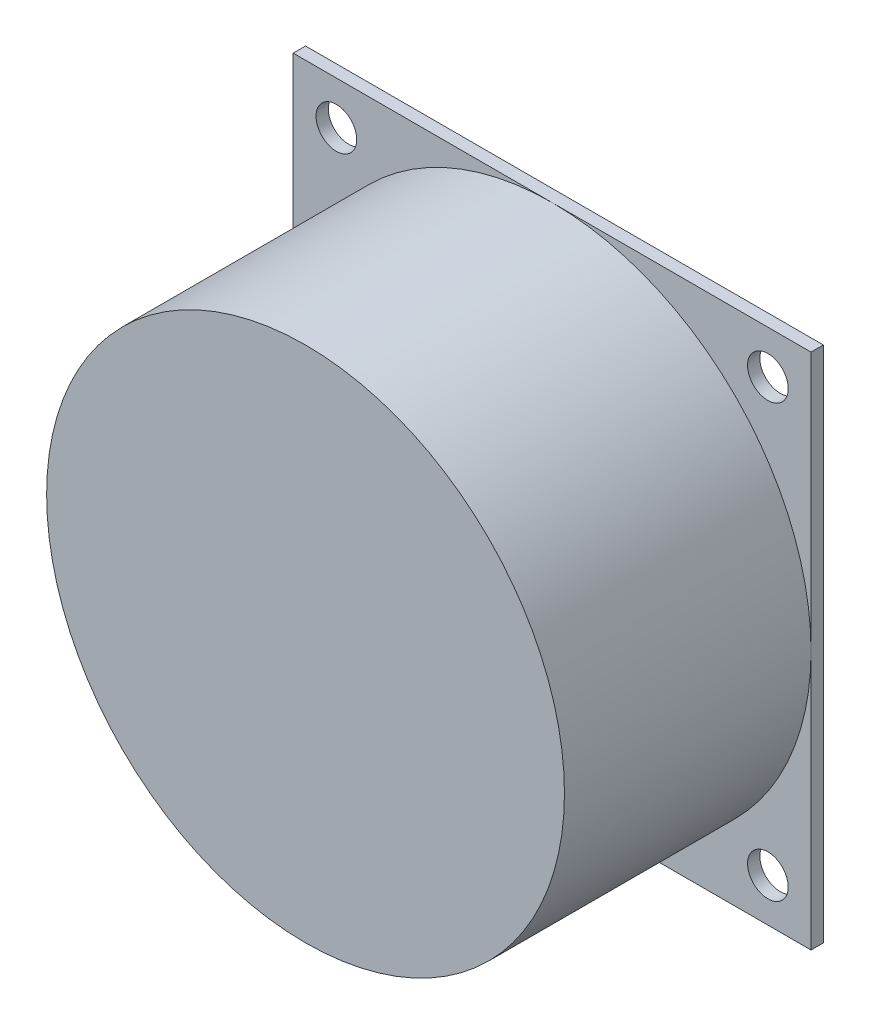
ISO-10303-21;
HEADER;
FILE_DESCRIPTION(('STEP AP214'),'2;1');
FILE_NAME('part.step','',(''),(''),'','','');
FILE_SCHEMA(('AUTOMOTIVE_DESIGN { 1 0 10303 214 1 1 1 1 }'));
ENDSEC;
DATA;
#1=APPLICATION_CONTEXT('core data for automotive mechanical design processes');
#2=APPLICATION_PROTOCOL_DEFINITION('international standard','automotive_design',2000,#1);
#3=PRODUCT_CONTEXT('',#1,'mechanical');
#4=PRODUCT('Part','Part','',(#3));
#5=PRODUCT_RELATED_PRODUCT_CATEGORY('part','',(#4));
#6=PRODUCT_DEFINITION_FORMATION('','',#4);
#7=PRODUCT_DEFINITION_CONTEXT('part definition',#1,'design');
#8=PRODUCT_DEFINITION('design','',#6,#7);
#9=PRODUCT_DEFINITION_SHAPE('','',#8);
#10=(LENGTH_UNIT() NAMED_UNIT(*) SI_UNIT(.MILLI.,.METRE.));
#11=(NAMED_UNIT(*) PLANE_ANGLE_UNIT() SI_UNIT($,.RADIAN.));
#12=(NAMED_UNIT(*) SI_UNIT($,.STERADIAN.) SOLID_ANGLE_UNIT());
#13=UNCERTAINTY_MEASURE_WITH_UNIT(LENGTH_MEASURE(1.E-05),#10,'distance_accuracy_value','');
#14=(GEOMETRIC_REPRESENTATION_CONTEXT(3) GLOBAL_UNCERTAINTY_ASSIGNED_CONTEXT((#13)) GLOBAL_UNIT_ASSIGNED_CONTEXT((#10,
#11,#12)) REPRESENTATION_CONTEXT('',''));
#15=CARTESIAN_POINT('',(0.,0.,0.));
#16=DIRECTION('',(0.,0.,1.));
#17=DIRECTION('',(1.,0.,0.));
#18=AXIS2_PLACEMENT_3D('',#15,#16,#17);
#19=CARTESIAN_POINT('',(0.,0.,1.));
#20=DIRECTION('',(0.,0.,1.));
#21=DIRECTION('',(1.,0.,0.));
#22=AXIS2_PLACEMENT_3D('',#19,#20,#21);
#23=PLANE('',#22);
#24=CARTESIAN_POINT('',(0.,0.,1.));
#25=DIRECTION('',(0.,0.,1.));
#26=DIRECTION('',(1.,0.,0.));
#27=AXIS2_PLACEMENT_3D('',#24,#25,#26);
#28=CIRCLE('',#27,21.);
#29=CARTESIAN_POINT('',(21.,0.,1.));
#30=VERTEX_POINT('',#29);
#31=CARTESIAN_POINT('',(0.,21.,1.));
#32=VERTEX_POINT('',#31);
#33=EDGE_CURVE('E122',#30,#32,#28,.T.);
#34=ORIENTED_EDGE('',*,*,#33,.F.);
#35=DIRECTION('',(0.,1.,0.));
#36=VECTOR('',#35,1.);
#37=CARTESIAN_POINT('',(21.,-21.,1.));
#38=LINE('',#37,#36);
#39=CARTESIAN_POINT('',(21.,21.,1.));
#40=VERTEX_POINT('',#39);
#41=EDGE_CURVE('E109',#30,#40,#38,.T.);
#42=ORIENTED_EDGE('',*,*,#41,.T.);
#43=DIRECTION('',(-1.,0.,0.));
#44=VECTOR('',#43,1.);
#45=CARTESIAN_POINT('',(21.,21.,1.));
#46=LINE('',#45,#44);
#47=EDGE_CURVE('E124',#40,#32,#46,.T.);
#48=ORIENTED_EDGE('',*,*,#47,.T.);
#49=EDGE_LOOP('',(#34,#42,#48));
#50=FACE_BOUND('',#49,.T.);
#51=CARTESIAN_POINT('',(17.5,17.5,1.));
#52=DIRECTION('',(0.,0.,1.));
#53=DIRECTION('',(1.,0.,0.));
#54=AXIS2_PLACEMENT_3D('',#51,#52,#53);
#55=CIRCLE('',#54,1.65);
#56=CARTESIAN_POINT('',(19.15,17.5,1.));
#57=VERTEX_POINT('',#56);
#58=EDGE_CURVE('E157',#57,#57,#55,.T.);
#59=ORIENTED_EDGE('',*,*,#58,.F.);
#60=EDGE_LOOP('',(#59));
#61=FACE_BOUND('',#60,.T.);
#62=ADVANCED_FACE('F45',(#50,#61),#23,.T.);
#63=CARTESIAN_POINT('',(-21.,0.,1.));
#64=VERTEX_POINT('',#63);
#65=EDGE_CURVE('E55',#32,#64,#28,.T.);
#66=ORIENTED_EDGE('',*,*,#65,.F.);
#67=CARTESIAN_POINT('',(-21.,21.,1.));
#68=VERTEX_POINT('',#67);
#69=EDGE_CURVE('E108',#32,#68,#46,.T.);
#70=ORIENTED_EDGE('',*,*,#69,.T.);
#71=DIRECTION('',(0.,-1.,0.));
#72=VECTOR('',#71,1.);
#73=CARTESIAN_POINT('',(-21.,-21.,1.));
#74=LINE('',#73,#72);
#75=EDGE_CURVE('E173',#68,#64,#74,.T.);
#76=ORIENTED_EDGE('',*,*,#75,.T.);
#77=EDGE_LOOP('',(#66,#70,#76));
#78=FACE_BOUND('',#77,.T.);
#79=CARTESIAN_POINT('',(-17.5,17.5,1.));
#80=DIRECTION('',(0.,0.,1.));
#81=DIRECTION('',(1.,0.,0.));
#82=AXIS2_PLACEMENT_3D('',#79,#80,#81);
#83=CIRCLE('',#82,1.65);
#84=CARTESIAN_POINT('',(-15.85,17.5,1.));
#85=VERTEX_POINT('',#84);
#86=EDGE_CURVE('E165',#85,#85,#83,.T.);
#87=ORIENTED_EDGE('',*,*,#86,.F.);
#88=EDGE_LOOP('',(#87));
#89=FACE_BOUND('',#88,.T.);
#90=ADVANCED_FACE('F214',(#78,#89),#23,.T.);
#91=CARTESIAN_POINT('',(0.,-21.,1.));
#92=VERTEX_POINT('',#91);
#93=EDGE_CURVE('E132',#64,#92,#28,.T.);
#94=ORIENTED_EDGE('',*,*,#93,.F.);
#95=CARTESIAN_POINT('',(-21.,-21.,1.));
#96=VERTEX_POINT('',#95);
#97=EDGE_CURVE('E176',#64,#96,#74,.T.);
#98=ORIENTED_EDGE('',*,*,#97,.T.);
#99=DIRECTION('',(1.,0.,0.));
#100=VECTOR('',#99,1.);
#101=CARTESIAN_POINT('',(21.,-21.,1.));
#102=LINE('',#101,#100);
#103=EDGE_CURVE('E120',#96,#92,#102,.T.);
#104=ORIENTED_EDGE('',*,*,#103,.T.);
#105=EDGE_LOOP('',(#94,#98,#104));
#106=FACE_BOUND('',#105,.T.);
#107=CARTESIAN_POINT('',(-17.5,-17.5,1.));
#108=DIRECTION('',(0.,0.,1.));
#109=DIRECTION('',(1.,0.,0.));
#110=AXIS2_PLACEMENT_3D('',#107,#108,#109);
#111=CIRCLE('',#110,1.65);
#112=CARTESIAN_POINT('',(-15.85,-17.5,1.));
#113=VERTEX_POINT('',#112);
#114=EDGE_CURVE('E140',#113,#113,#111,.T.);
#115=ORIENTED_EDGE('',*,*,#114,.F.);
#116=EDGE_LOOP('',(#115));
#117=FACE_BOUND('',#116,.T.);
#118=ADVANCED_FACE('F244',(#106,#117),#23,.T.);
#119=EDGE_CURVE('E70',#92,#30,#28,.T.);
#120=ORIENTED_EDGE('',*,*,#119,.F.);
#121=CARTESIAN_POINT('',(21.,-21.,1.));
#122=VERTEX_POINT('',#121);
#123=EDGE_CURVE('E103',#92,#122,#102,.T.);
#124=ORIENTED_EDGE('',*,*,#123,.T.);
#125=EDGE_CURVE('E99',#122,#30,#38,.T.);
#126=ORIENTED_EDGE('',*,*,#125,.T.);
#127=EDGE_LOOP('',(#120,#124,#126));
#128=FACE_BOUND('',#127,.T.);
#129=CARTESIAN_POINT('',(17.5,-17.5,1.));
#130=DIRECTION('',(0.,0.,1.));
#131=DIRECTION('',(1.,0.,0.));
#132=AXIS2_PLACEMENT_3D('',#129,#130,#131);
#133=CIRCLE('',#132,1.65);
#134=CARTESIAN_POINT('',(19.15,-17.5,1.));
#135=VERTEX_POINT('',#134);
#136=EDGE_CURVE('E149',#135,#135,#133,.T.);
#137=ORIENTED_EDGE('',*,*,#136,.F.);
#138=EDGE_LOOP('',(#137));
#139=FACE_BOUND('',#138,.T.);
#140=ADVANCED_FACE('F101',(#128,#139),#23,.T.);
#141=CARTESIAN_POINT('',(0.,0.,0.));
#142=DIRECTION('',(0.,0.,1.));
#143=DIRECTION('',(1.,0.,0.));
#144=AXIS2_PLACEMENT_3D('',#141,#142,#143);
#145=PLANE('',#144);
#146=CARTESIAN_POINT('',(0.,0.,0.));
#147=DIRECTION('',(0.,0.,-1.));
#148=DIRECTION('',(-1.,0.,0.));
#149=AXIS2_PLACEMENT_3D('',#146,#147,#148);
#150=CIRCLE('',#149,5.);
#151=CARTESIAN_POINT('',(-5.,0.,0.));
#152=VERTEX_POINT('',#151);
#153=EDGE_CURVE('E11',#152,#152,#150,.T.);
#154=ORIENTED_EDGE('',*,*,#153,.F.);
#155=EDGE_LOOP('',(#154));
#156=FACE_BOUND('',#155,.T.);
#157=DIRECTION('',(0.,-1.,0.));
#158=VECTOR('',#157,1.);
#159=CARTESIAN_POINT('',(-21.,-21.,0.));
#160=LINE('',#159,#158);
#161=CARTESIAN_POINT('',(-21.,21.,0.));
#162=VERTEX_POINT('',#161);
#163=CARTESIAN_POINT('',(-21.,-21.,0.));
#164=VERTEX_POINT('',#163);
#165=EDGE_CURVE('E169',#162,#164,#160,.T.);
#166=ORIENTED_EDGE('',*,*,#165,.F.);
#167=DIRECTION('',(-1.,0.,0.));
#168=VECTOR('',#167,1.);
#169=CARTESIAN_POINT('',(21.,21.,0.));
#170=LINE('',#169,#168);
#171=CARTESIAN_POINT('',(21.,21.,0.));
#172=VERTEX_POINT('',#171);
#173=EDGE_CURVE('E192',#172,#162,#170,.T.);
#174=ORIENTED_EDGE('',*,*,#173,.F.);
#175=DIRECTION('',(0.,1.,0.));
#176=VECTOR('',#175,1.);
#177=CARTESIAN_POINT('',(21.,-21.,0.));
#178=LINE('',#177,#176);
#179=CARTESIAN_POINT('',(21.,-21.,0.));
#180=VERTEX_POINT('',#179);
#181=EDGE_CURVE('E189',#180,#172,#178,.T.);
#182=ORIENTED_EDGE('',*,*,#181,.F.);
#183=DIRECTION('',(1.,0.,0.));
#184=VECTOR('',#183,1.);
#185=CARTESIAN_POINT('',(21.,-21.,0.));
#186=LINE('',#185,#184);
#187=EDGE_CURVE('E186',#164,#180,#186,.T.);
#188=ORIENTED_EDGE('',*,*,#187,.F.);
#189=EDGE_LOOP('',(#166,#174,#182,#188));
#190=FACE_BOUND('',#189,.T.);
#191=CARTESIAN_POINT('',(-17.5,17.5,0.));
#192=DIRECTION('',(0.,0.,1.));
#193=DIRECTION('',(1.,0.,0.));
#194=AXIS2_PLACEMENT_3D('',#191,#192,#193);
#195=CIRCLE('',#194,1.65);
#196=CARTESIAN_POINT('',(-15.85,17.5,0.));
#197=VERTEX_POINT('',#196);
#198=EDGE_CURVE('E161',#197,#197,#195,.T.);
#199=ORIENTED_EDGE('',*,*,#198,.T.);
#200=EDGE_LOOP('',(#199));
#201=FACE_BOUND('',#200,.T.);
#202=CARTESIAN_POINT('',(17.5,17.5,0.));
#203=DIRECTION('',(0.,0.,1.));
#204=DIRECTION('',(1.,0.,0.));
#205=AXIS2_PLACEMENT_3D('',#202,#203,#204);
#206=CIRCLE('',#205,1.65);
#207=CARTESIAN_POINT('',(19.15,17.5,0.));
#208=VERTEX_POINT('',#207);
#209=EDGE_CURVE('E153',#208,#208,#206,.T.);
#210=ORIENTED_EDGE('',*,*,#209,.T.);
#211=EDGE_LOOP('',(#210));
#212=FACE_BOUND('',#211,.T.);
#213=CARTESIAN_POINT('',(17.5,-17.5,0.));
#214=DIRECTION('',(0.,0.,1.));
#215=DIRECTION('',(1.,0.,0.));
#216=AXIS2_PLACEMENT_3D('',#213,#214,#215);
#217=CIRCLE('',#216,1.65);
#218=CARTESIAN_POINT('',(19.15,-17.5,0.));
#219=VERTEX_POINT('',#218);
#220=EDGE_CURVE('E144',#219,#219,#217,.T.);
#221=ORIENTED_EDGE('',*,*,#220,.T.);
#222=EDGE_LOOP('',(#221));
#223=FACE_BOUND('',#222,.T.);
#224=CARTESIAN_POINT('',(-17.5,-17.5,0.));
#225=DIRECTION('',(0.,0.,1.));
#226=DIRECTION('',(1.,0.,0.));
#227=AXIS2_PLACEMENT_3D('',#224,#225,#226);
#228=CIRCLE('',#227,1.65);
#229=CARTESIAN_POINT('',(-15.85,-17.5,0.));
#230=VERTEX_POINT('',#229);
#231=EDGE_CURVE('E145',#230,#230,#228,.T.);
#232=ORIENTED_EDGE('',*,*,#231,.T.);
#233=EDGE_LOOP('',(#232));
#234=FACE_BOUND('',#233,.T.);
#235=ADVANCED_FACE('F205',(#156,#190,#201,#212,#223,#234),#145,.F.);
#236=CARTESIAN_POINT('',(-21.,-21.,1.));
#237=DIRECTION('',(1.,0.,0.));
#238=DIRECTION('',(0.,0.,-1.));
#239=AXIS2_PLACEMENT_3D('',#236,#237,#238);
#240=PLANE('',#239);
#241=ORIENTED_EDGE('',*,*,#165,.T.);
#242=DIRECTION('',(0.,0.,-1.));
#243=VECTOR('',#242,1.);
#244=CARTESIAN_POINT('',(-21.,-21.,1.));
#245=LINE('',#244,#243);
#246=EDGE_CURVE('E49',#96,#164,#245,.T.);
#247=ORIENTED_EDGE('',*,*,#246,.F.);
#248=ORIENTED_EDGE('',*,*,#97,.F.);
#249=ORIENTED_EDGE('',*,*,#75,.F.);
#250=DIRECTION('',(0.,0.,-1.));
#251=VECTOR('',#250,1.);
#252=CARTESIAN_POINT('',(-21.,21.,1.));
#253=LINE('',#252,#251);
#254=EDGE_CURVE('E182',#68,#162,#253,.T.);
#255=ORIENTED_EDGE('',*,*,#254,.T.);
#256=EDGE_LOOP('',(#241,#247,#248,#249,#255));
#257=FACE_BOUND('',#256,.T.);
#258=ADVANCED_FACE('F47',(#257),#240,.F.);
#259=CARTESIAN_POINT('',(21.,-21.,1.));
#260=DIRECTION('',(0.,1.,0.));
#261=DIRECTION('',(-1.,0.,0.));
#262=AXIS2_PLACEMENT_3D('',#259,#260,#261);
#263=PLANE('',#262);
#264=ORIENTED_EDGE('',*,*,#187,.T.);
#265=DIRECTION('',(0.,0.,-1.));
#266=VECTOR('',#265,1.);
#267=CARTESIAN_POINT('',(21.,-21.,1.));
#268=LINE('',#267,#266);
#269=EDGE_CURVE('E137',#122,#180,#268,.T.);
#270=ORIENTED_EDGE('',*,*,#269,.F.);
#271=ORIENTED_EDGE('',*,*,#123,.F.);
#272=ORIENTED_EDGE('',*,*,#103,.F.);
#273=ORIENTED_EDGE('',*,*,#246,.T.);
#274=EDGE_LOOP('',(#264,#270,#271,#272,#273));
#275=FACE_BOUND('',#274,.T.);
#276=ADVANCED_FACE('F242',(#275),#263,.F.);
#277=CARTESIAN_POINT('',(21.,-21.,1.));
#278=DIRECTION('',(-1.,0.,0.));
#279=DIRECTION('',(0.,0.,1.));
#280=AXIS2_PLACEMENT_3D('',#277,#278,#279);
#281=PLANE('',#280);
#282=ORIENTED_EDGE('',*,*,#181,.T.);
#283=DIRECTION('',(0.,0.,-1.));
#284=VECTOR('',#283,1.);
#285=CARTESIAN_POINT('',(21.,21.,1.));
#286=LINE('',#285,#284);
#287=EDGE_CURVE('E115',#40,#172,#286,.T.);
#288=ORIENTED_EDGE('',*,*,#287,.F.);
#289=ORIENTED_EDGE('',*,*,#41,.F.);
#290=ORIENTED_EDGE('',*,*,#125,.F.);
#291=ORIENTED_EDGE('',*,*,#269,.T.);
#292=EDGE_LOOP('',(#282,#288,#289,#290,#291));
#293=FACE_BOUND('',#292,.T.);
#294=ADVANCED_FACE('F113',(#293),#281,.F.);
#295=CARTESIAN_POINT('',(21.,21.,1.));
#296=DIRECTION('',(0.,-1.,0.));
#297=DIRECTION('',(1.,0.,0.));
#298=AXIS2_PLACEMENT_3D('',#295,#296,#297);
#299=PLANE('',#298);
#300=ORIENTED_EDGE('',*,*,#173,.T.);
#301=ORIENTED_EDGE('',*,*,#254,.F.);
#302=ORIENTED_EDGE('',*,*,#69,.F.);
#303=ORIENTED_EDGE('',*,*,#47,.F.);
#304=ORIENTED_EDGE('',*,*,#287,.T.);
#305=EDGE_LOOP('',(#300,#301,#302,#303,#304));
#306=FACE_BOUND('',#305,.T.);
#307=ADVANCED_FACE('F209',(#306),#299,.F.);
#308=CARTESIAN_POINT('',(-17.5,17.5,1.));
#309=DIRECTION('',(0.,0.,-1.));
#310=DIRECTION('',(-1.,0.,0.));
#311=AXIS2_PLACEMENT_3D('',#308,#309,#310);
#312=CYLINDRICAL_SURFACE('',#311,1.65);
#313=ORIENTED_EDGE('',*,*,#86,.T.);
#314=EDGE_LOOP('',(#313));
#315=FACE_BOUND('',#314,.T.);
#316=ORIENTED_EDGE('',*,*,#198,.F.);
#317=EDGE_LOOP('',(#316));
#318=FACE_BOUND('',#317,.T.);
#319=ADVANCED_FACE('F253',(#315,#318),#312,.F.);
#320=CARTESIAN_POINT('',(17.5,17.5,1.));
#321=DIRECTION('',(0.,0.,-1.));
#322=DIRECTION('',(-1.,0.,0.));
#323=AXIS2_PLACEMENT_3D('',#320,#321,#322);
#324=CYLINDRICAL_SURFACE('',#323,1.65);
#325=ORIENTED_EDGE('',*,*,#58,.T.);
#326=EDGE_LOOP('',(#325));
#327=FACE_BOUND('',#326,.T.);
#328=ORIENTED_EDGE('',*,*,#209,.F.);
#329=EDGE_LOOP('',(#328));
#330=FACE_BOUND('',#329,.T.);
#331=ADVANCED_FACE('F256',(#327,#330),#324,.F.);
#332=CARTESIAN_POINT('',(17.5,-17.5,1.));
#333=DIRECTION('',(0.,0.,-1.));
#334=DIRECTION('',(-1.,0.,0.));
#335=AXIS2_PLACEMENT_3D('',#332,#333,#334);
#336=CYLINDRICAL_SURFACE('',#335,1.65);
#337=ORIENTED_EDGE('',*,*,#136,.T.);
#338=EDGE_LOOP('',(#337));
#339=FACE_BOUND('',#338,.T.);
#340=ORIENTED_EDGE('',*,*,#220,.F.);
#341=EDGE_LOOP('',(#340));
#342=FACE_BOUND('',#341,.T.);
#343=ADVANCED_FACE('F260',(#339,#342),#336,.F.);
#344=CARTESIAN_POINT('',(-17.5,-17.5,1.));
#345=DIRECTION('',(0.,0.,-1.));
#346=DIRECTION('',(-1.,0.,0.));
#347=AXIS2_PLACEMENT_3D('',#344,#345,#346);
#348=CYLINDRICAL_SURFACE('',#347,1.65);
#349=ORIENTED_EDGE('',*,*,#114,.T.);
#350=EDGE_LOOP('',(#349));
#351=FACE_BOUND('',#350,.T.);
#352=ORIENTED_EDGE('',*,*,#231,.F.);
#353=EDGE_LOOP('',(#352));
#354=FACE_BOUND('',#353,.T.);
#355=ADVANCED_FACE('F264',(#351,#354),#348,.F.);
#356=CARTESIAN_POINT('',(0.,0.,21.));
#357=DIRECTION('',(0.,0.,-1.));
#358=DIRECTION('',(-1.,0.,0.));
#359=AXIS2_PLACEMENT_3D('',#356,#357,#358);
#360=CYLINDRICAL_SURFACE('',#359,21.);
#361=CARTESIAN_POINT('',(0.,0.,21.));
#362=DIRECTION('',(0.,0.,1.));
#363=DIRECTION('',(1.,0.,0.));
#364=AXIS2_PLACEMENT_3D('',#361,#362,#363);
#365=CIRCLE('',#364,21.);
#366=CARTESIAN_POINT('',(21.,0.,21.));
#367=VERTEX_POINT('',#366);
#368=EDGE_CURVE('E127',#367,#367,#365,.T.);
#369=ORIENTED_EDGE('',*,*,#368,.F.);
#370=EDGE_LOOP('',(#369));
#371=FACE_BOUND('',#370,.T.);
#372=ORIENTED_EDGE('',*,*,#33,.T.);
#373=ORIENTED_EDGE('',*,*,#65,.T.);
#374=ORIENTED_EDGE('',*,*,#93,.T.);
#375=ORIENTED_EDGE('',*,*,#119,.T.);
#376=EDGE_LOOP('',(#372,#373,#374,#375));
#377=FACE_BOUND('',#376,.T.);
#378=ADVANCED_FACE('F131',(#371,#377),#360,.T.);
#379=CARTESIAN_POINT('',(0.,0.,21.));
#380=DIRECTION('',(0.,0.,1.));
#381=DIRECTION('',(1.,0.,0.));
#382=AXIS2_PLACEMENT_3D('',#379,#380,#381);
#383=PLANE('',#382);
#384=ORIENTED_EDGE('',*,*,#368,.T.);
#385=EDGE_LOOP('',(#384));
#386=FACE_BOUND('',#385,.T.);
#387=ADVANCED_FACE('F232',(#386),#383,.T.);
#388=CARTESIAN_POINT('',(0.,0.,-10.));
#389=DIRECTION('',(0.,0.,1.));
#390=DIRECTION('',(1.,0.,0.));
#391=AXIS2_PLACEMENT_3D('',#388,#389,#390);
#392=CYLINDRICAL_SURFACE('',#391,5.);
#393=CARTESIAN_POINT('',(0.,0.,-10.));
#394=DIRECTION('',(0.,0.,-1.));
#395=DIRECTION('',(-1.,0.,0.));
#396=AXIS2_PLACEMENT_3D('',#393,#394,#395);
#397=CIRCLE('',#396,5.);
#398=CARTESIAN_POINT('',(-5.,0.,-10.));
#399=VERTEX_POINT('',#398);
#400=EDGE_CURVE('E128',#399,#399,#397,.T.);
#401=ORIENTED_EDGE('',*,*,#400,.F.);
#402=EDGE_LOOP('',(#401));
#403=FACE_BOUND('',#402,.T.);
#404=ORIENTED_EDGE('',*,*,#153,.T.);
#405=EDGE_LOOP('',(#404));
#406=FACE_BOUND('',#405,.T.);
#407=ADVANCED_FACE('F229',(#403,#406),#392,.T.);
#408=CARTESIAN_POINT('',(0.,0.,-10.));
#409=DIRECTION('',(0.,0.,-1.));
#410=DIRECTION('',(-1.,0.,0.));
#411=AXIS2_PLACEMENT_3D('',#408,#409,#410);
#412=PLANE('',#411);
#413=ORIENTED_EDGE('',*,*,#400,.T.);
#414=EDGE_LOOP('',(#413));
#415=FACE_BOUND('',#414,.T.);
#416=ADVANCED_FACE('F227',(#415),#412,.T.);
#417=CLOSED_SHELL('',(#62,#90,#118,#140,#235,#258,#276,#294,#307,#319,#331,#343,#355,#378,#387,
#407,#416));
#418=MANIFOLD_SOLID_BREP('B2',#417);
#419=ADVANCED_BREP_SHAPE_REPRESENTATION('',(#18,#418),#14);
#420=SHAPE_DEFINITION_REPRESENTATION(#9,#419);
ENDSEC;
END-ISO-10303-21;
